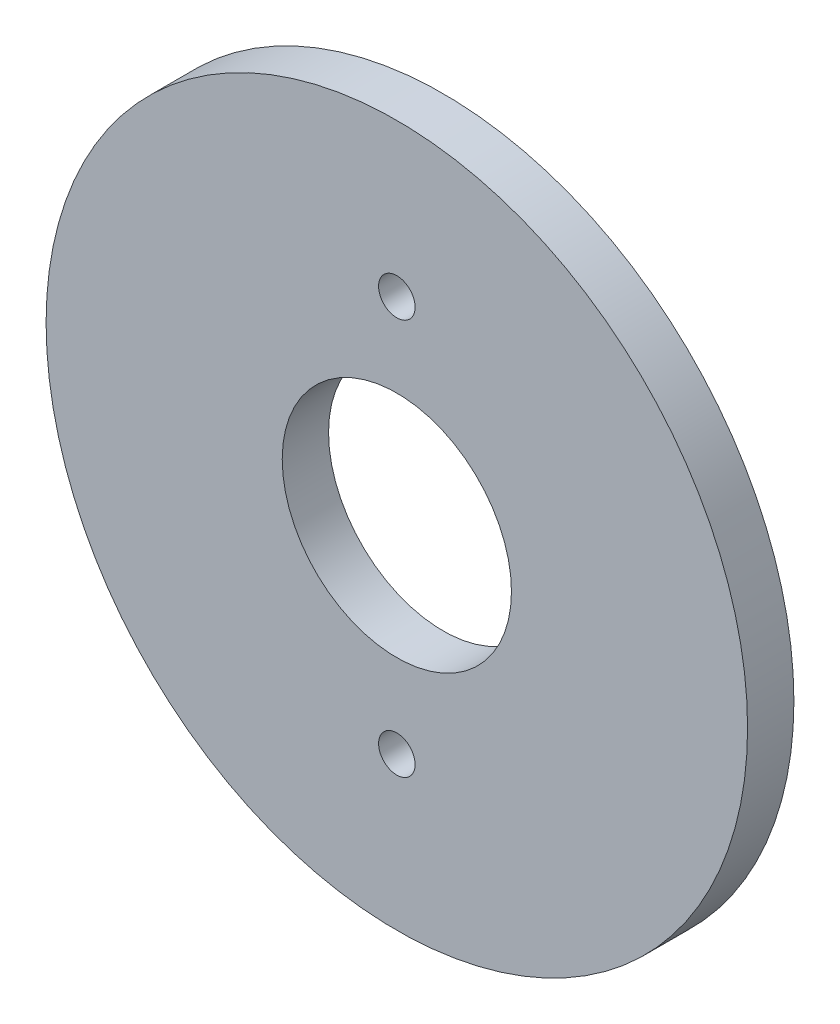
ISO-10303-21;
HEADER;
FILE_DESCRIPTION(('STEP AP214'),'2;1');
FILE_NAME('part.step','',(''),(''),'','','');
FILE_SCHEMA(('AUTOMOTIVE_DESIGN { 1 0 10303 214 1 1 1 1 }'));
ENDSEC;
DATA;
#1=APPLICATION_CONTEXT('core data for automotive mechanical design processes');
#2=APPLICATION_PROTOCOL_DEFINITION('international standard','automotive_design',2000,#1);
#3=PRODUCT_CONTEXT('',#1,'mechanical');
#4=PRODUCT('Part','Part','',(#3));
#5=PRODUCT_RELATED_PRODUCT_CATEGORY('part','',(#4));
#6=PRODUCT_DEFINITION_FORMATION('','',#4);
#7=PRODUCT_DEFINITION_CONTEXT('part definition',#1,'design');
#8=PRODUCT_DEFINITION('design','',#6,#7);
#9=PRODUCT_DEFINITION_SHAPE('','',#8);
#10=(LENGTH_UNIT() NAMED_UNIT(*) SI_UNIT(.MILLI.,.METRE.));
#11=(NAMED_UNIT(*) PLANE_ANGLE_UNIT() SI_UNIT($,.RADIAN.));
#12=(NAMED_UNIT(*) SI_UNIT($,.STERADIAN.) SOLID_ANGLE_UNIT());
#13=UNCERTAINTY_MEASURE_WITH_UNIT(LENGTH_MEASURE(1.E-05),#10,'distance_accuracy_value','');
#14=(GEOMETRIC_REPRESENTATION_CONTEXT(3) GLOBAL_UNCERTAINTY_ASSIGNED_CONTEXT((#13)) GLOBAL_UNIT_ASSIGNED_CONTEXT((#10,
#11,#12)) REPRESENTATION_CONTEXT('',''));
#15=CARTESIAN_POINT('',(0.,0.,0.));
#16=DIRECTION('',(0.,0.,1.));
#17=DIRECTION('',(1.,0.,0.));
#18=AXIS2_PLACEMENT_3D('',#15,#16,#17);
#19=CARTESIAN_POINT('',(0.,0.,4.445));
#20=DIRECTION('',(0.,0.,1.));
#21=DIRECTION('',(1.,0.,0.));
#22=AXIS2_PLACEMENT_3D('',#19,#20,#21);
#23=PLANE('',#22);
#24=CARTESIAN_POINT('',(0.,0.,4.445));
#25=DIRECTION('',(0.,0.,1.));
#26=DIRECTION('',(1.,0.,0.));
#27=AXIS2_PLACEMENT_3D('',#24,#25,#26);
#28=CIRCLE('',#27,10.9982);
#29=CARTESIAN_POINT('',(10.9982,0.,4.445));
#30=VERTEX_POINT('',#29);
#31=EDGE_CURVE('E48',#30,#30,#28,.T.);
#32=ORIENTED_EDGE('',*,*,#31,.F.);
#33=EDGE_LOOP('',(#32));
#34=FACE_BOUND('',#33,.T.);
#35=CARTESIAN_POINT('',(0.,0.,4.445));
#36=DIRECTION('',(0.,0.,1.));
#37=DIRECTION('',(1.,0.,0.));
#38=AXIS2_PLACEMENT_3D('',#35,#36,#37);
#39=CIRCLE('',#38,33.655);
#40=CARTESIAN_POINT('',(33.655,0.,4.445));
#41=VERTEX_POINT('',#40);
#42=EDGE_CURVE('E10',#41,#41,#39,.T.);
#43=ORIENTED_EDGE('',*,*,#42,.T.);
#44=EDGE_LOOP('',(#43));
#45=FACE_BOUND('',#44,.T.);
#46=CARTESIAN_POINT('',(0.,18.9992,4.445));
#47=DIRECTION('',(0.,0.,1.));
#48=DIRECTION('',(1.,0.,0.));
#49=AXIS2_PLACEMENT_3D('',#46,#47,#48);
#50=CIRCLE('',#49,1.7526);
#51=CARTESIAN_POINT('',(1.7526,18.9992,4.445));
#52=VERTEX_POINT('',#51);
#53=EDGE_CURVE('E43',#52,#52,#50,.T.);
#54=ORIENTED_EDGE('',*,*,#53,.F.);
#55=EDGE_LOOP('',(#54));
#56=FACE_BOUND('',#55,.T.);
#57=CARTESIAN_POINT('',(0.,-18.9992,4.445));
#58=DIRECTION('',(0.,0.,1.));
#59=DIRECTION('',(1.,0.,0.));
#60=AXIS2_PLACEMENT_3D('',#57,#58,#59);
#61=CIRCLE('',#60,1.7526);
#62=CARTESIAN_POINT('',(1.7526,-18.9992,4.445));
#63=VERTEX_POINT('',#62);
#64=EDGE_CURVE('E54',#63,#63,#61,.T.);
#65=ORIENTED_EDGE('',*,*,#64,.F.);
#66=EDGE_LOOP('',(#65));
#67=FACE_BOUND('',#66,.T.);
#68=ADVANCED_FACE('F32',(#34,#45,#56,#67),#23,.T.);
#69=CARTESIAN_POINT('',(0.,0.,0.));
#70=DIRECTION('',(0.,0.,1.));
#71=DIRECTION('',(1.,0.,0.));
#72=AXIS2_PLACEMENT_3D('',#69,#70,#71);
#73=PLANE('',#72);
#74=CARTESIAN_POINT('',(0.,0.,0.));
#75=DIRECTION('',(0.,0.,1.));
#76=DIRECTION('',(1.,0.,0.));
#77=AXIS2_PLACEMENT_3D('',#74,#75,#76);
#78=CIRCLE('',#77,10.9982);
#79=CARTESIAN_POINT('',(10.9982,0.,0.));
#80=VERTEX_POINT('',#79);
#81=EDGE_CURVE('E51',#80,#80,#78,.T.);
#82=ORIENTED_EDGE('',*,*,#81,.T.);
#83=EDGE_LOOP('',(#82));
#84=FACE_BOUND('',#83,.T.);
#85=CARTESIAN_POINT('',(0.,0.,0.));
#86=DIRECTION('',(0.,0.,1.));
#87=DIRECTION('',(1.,0.,0.));
#88=AXIS2_PLACEMENT_3D('',#85,#86,#87);
#89=CIRCLE('',#88,33.655);
#90=CARTESIAN_POINT('',(33.655,0.,0.));
#91=VERTEX_POINT('',#90);
#92=EDGE_CURVE('E36',#91,#91,#89,.T.);
#93=ORIENTED_EDGE('',*,*,#92,.F.);
#94=EDGE_LOOP('',(#93));
#95=FACE_BOUND('',#94,.T.);
#96=CARTESIAN_POINT('',(0.,18.9992,0.));
#97=DIRECTION('',(0.,0.,1.));
#98=DIRECTION('',(1.,0.,0.));
#99=AXIS2_PLACEMENT_3D('',#96,#97,#98);
#100=CIRCLE('',#99,1.7526);
#101=CARTESIAN_POINT('',(1.7526,18.9992,0.));
#102=VERTEX_POINT('',#101);
#103=EDGE_CURVE('E45',#102,#102,#100,.T.);
#104=ORIENTED_EDGE('',*,*,#103,.T.);
#105=EDGE_LOOP('',(#104));
#106=FACE_BOUND('',#105,.T.);
#107=CARTESIAN_POINT('',(0.,-18.9992,0.));
#108=DIRECTION('',(0.,0.,1.));
#109=DIRECTION('',(1.,0.,0.));
#110=AXIS2_PLACEMENT_3D('',#107,#108,#109);
#111=CIRCLE('',#110,1.7526);
#112=CARTESIAN_POINT('',(1.7526,-18.9992,0.));
#113=VERTEX_POINT('',#112);
#114=EDGE_CURVE('E57',#113,#113,#111,.T.);
#115=ORIENTED_EDGE('',*,*,#114,.T.);
#116=EDGE_LOOP('',(#115));
#117=FACE_BOUND('',#116,.T.);
#118=ADVANCED_FACE('F67',(#84,#95,#106,#117),#73,.F.);
#119=CARTESIAN_POINT('',(0.,0.,4.445));
#120=DIRECTION('',(0.,0.,-1.));
#121=DIRECTION('',(-1.,0.,0.));
#122=AXIS2_PLACEMENT_3D('',#119,#120,#121);
#123=CYLINDRICAL_SURFACE('',#122,33.655);
#124=ORIENTED_EDGE('',*,*,#42,.F.);
#125=EDGE_LOOP('',(#124));
#126=FACE_BOUND('',#125,.T.);
#127=ORIENTED_EDGE('',*,*,#92,.T.);
#128=EDGE_LOOP('',(#127));
#129=FACE_BOUND('',#128,.T.);
#130=ADVANCED_FACE('F34',(#126,#129),#123,.T.);
#131=CARTESIAN_POINT('',(0.,18.9992,4.445));
#132=DIRECTION('',(0.,0.,-1.));
#133=DIRECTION('',(-1.,0.,0.));
#134=AXIS2_PLACEMENT_3D('',#131,#132,#133);
#135=CYLINDRICAL_SURFACE('',#134,1.7526);
#136=ORIENTED_EDGE('',*,*,#53,.T.);
#137=EDGE_LOOP('',(#136));
#138=FACE_BOUND('',#137,.T.);
#139=ORIENTED_EDGE('',*,*,#103,.F.);
#140=EDGE_LOOP('',(#139));
#141=FACE_BOUND('',#140,.T.);
#142=ADVANCED_FACE('F76',(#138,#141),#135,.F.);
#143=CARTESIAN_POINT('',(0.,0.,4.445));
#144=DIRECTION('',(0.,0.,-1.));
#145=DIRECTION('',(-1.,0.,0.));
#146=AXIS2_PLACEMENT_3D('',#143,#144,#145);
#147=CYLINDRICAL_SURFACE('',#146,10.9982);
#148=ORIENTED_EDGE('',*,*,#31,.T.);
#149=EDGE_LOOP('',(#148));
#150=FACE_BOUND('',#149,.T.);
#151=ORIENTED_EDGE('',*,*,#81,.F.);
#152=EDGE_LOOP('',(#151));
#153=FACE_BOUND('',#152,.T.);
#154=ADVANCED_FACE('F79',(#150,#153),#147,.F.);
#155=CARTESIAN_POINT('',(0.,-18.9992,4.445));
#156=DIRECTION('',(0.,0.,-1.));
#157=DIRECTION('',(-1.,0.,0.));
#158=AXIS2_PLACEMENT_3D('',#155,#156,#157);
#159=CYLINDRICAL_SURFACE('',#158,1.7526);
#160=ORIENTED_EDGE('',*,*,#64,.T.);
#161=EDGE_LOOP('',(#160));
#162=FACE_BOUND('',#161,.T.);
#163=ORIENTED_EDGE('',*,*,#114,.F.);
#164=EDGE_LOOP('',(#163));
#165=FACE_BOUND('',#164,.T.);
#166=ADVANCED_FACE('F63',(#162,#165),#159,.F.);
#167=CLOSED_SHELL('',(#68,#118,#130,#142,#154,#166));
#168=MANIFOLD_SOLID_BREP('B2',#167);
#169=ADVANCED_BREP_SHAPE_REPRESENTATION('',(#18,#168),#14);
#170=SHAPE_DEFINITION_REPRESENTATION(#9,#169);
ENDSEC;
END-ISO-10303-21;
